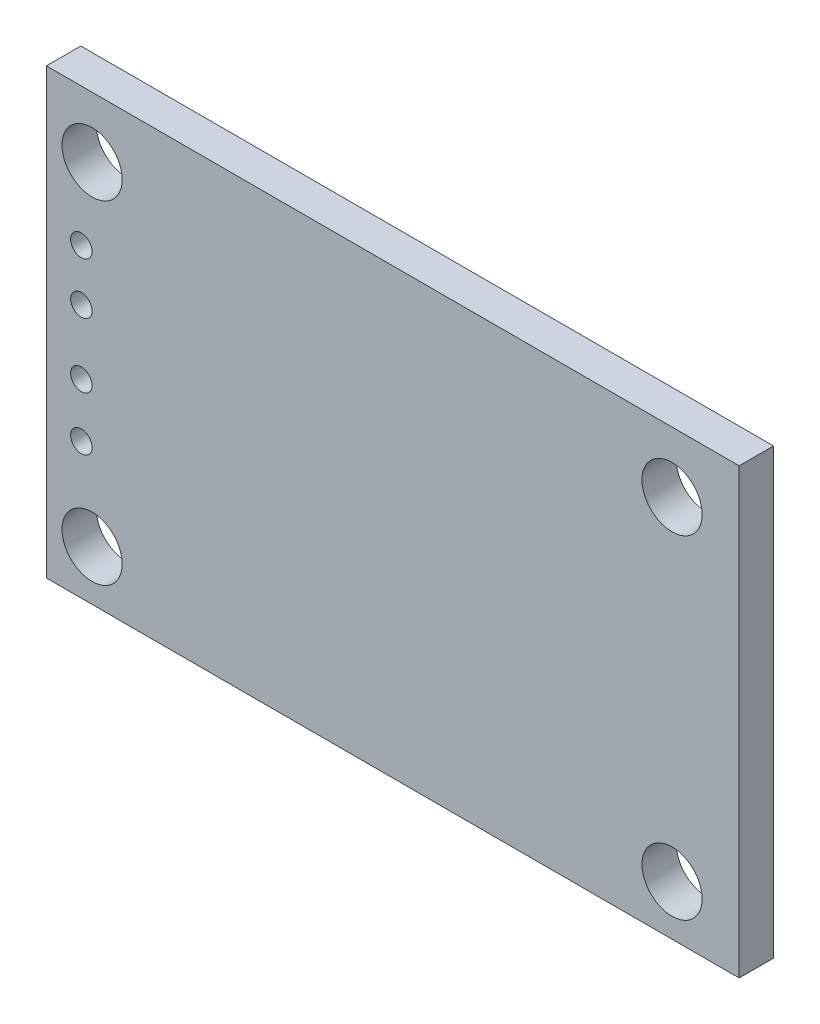
ISO-10303-21;
HEADER;
FILE_DESCRIPTION(('STEP AP214'),'2;1');
FILE_NAME('part.step','',(''),(''),'','','');
FILE_SCHEMA(('AUTOMOTIVE_DESIGN { 1 0 10303 214 1 1 1 1 }'));
ENDSEC;
DATA;
#1=APPLICATION_CONTEXT('core data for automotive mechanical design processes');
#2=APPLICATION_PROTOCOL_DEFINITION('international standard','automotive_design',2000,#1);
#3=PRODUCT_CONTEXT('',#1,'mechanical');
#4=PRODUCT('Part','Part','',(#3));
#5=PRODUCT_RELATED_PRODUCT_CATEGORY('part','',(#4));
#6=PRODUCT_DEFINITION_FORMATION('','',#4);
#7=PRODUCT_DEFINITION_CONTEXT('part definition',#1,'design');
#8=PRODUCT_DEFINITION('design','',#6,#7);
#9=PRODUCT_DEFINITION_SHAPE('','',#8);
#10=(LENGTH_UNIT() NAMED_UNIT(*) SI_UNIT(.MILLI.,.METRE.));
#11=(NAMED_UNIT(*) PLANE_ANGLE_UNIT() SI_UNIT($,.RADIAN.));
#12=(NAMED_UNIT(*) SI_UNIT($,.STERADIAN.) SOLID_ANGLE_UNIT());
#13=UNCERTAINTY_MEASURE_WITH_UNIT(LENGTH_MEASURE(1.E-05),#10,'distance_accuracy_value','');
#14=(GEOMETRIC_REPRESENTATION_CONTEXT(3) GLOBAL_UNCERTAINTY_ASSIGNED_CONTEXT((#13)) GLOBAL_UNIT_ASSIGNED_CONTEXT((#10,
#11,#12)) REPRESENTATION_CONTEXT('',''));
#15=CARTESIAN_POINT('',(0.,0.,0.));
#16=DIRECTION('',(0.,0.,1.));
#17=DIRECTION('',(1.,0.,0.));
#18=AXIS2_PLACEMENT_3D('',#15,#16,#17);
#19=CARTESIAN_POINT('',(-14.50000021606,1.500000022352,1.6));
#20=DIRECTION('',(0.,0.,-1.));
#21=DIRECTION('',(-1.,0.,0.));
#22=AXIS2_PLACEMENT_3D('',#19,#20,#21);
#23=CYLINDRICAL_SURFACE('',#22,0.5);
#24=CARTESIAN_POINT('',(-14.50000021606,1.500000022352,0.));
#25=DIRECTION('',(0.,0.,1.));
#26=DIRECTION('',(-1.,0.,0.));
#27=AXIS2_PLACEMENT_3D('',#24,#25,#26);
#28=CIRCLE('',#27,0.5);
#29=CARTESIAN_POINT('',(-15.00000021606,1.500000022352,0.));
#30=VERTEX_POINT('',#29);
#31=EDGE_CURVE('E94',#30,#30,#28,.T.);
#32=ORIENTED_EDGE('',*,*,#31,.F.);
#33=EDGE_LOOP('',(#32));
#34=FACE_BOUND('',#33,.T.);
#35=CARTESIAN_POINT('',(-14.50000021606,1.500000022352,1.6));
#36=DIRECTION('',(0.,0.,-1.));
#37=DIRECTION('',(-1.,0.,0.));
#38=AXIS2_PLACEMENT_3D('',#35,#36,#37);
#39=CIRCLE('',#38,0.5);
#40=CARTESIAN_POINT('',(-15.00000021606,1.500000022352,1.6));
#41=VERTEX_POINT('',#40);
#42=EDGE_CURVE('E82',#41,#41,#39,.T.);
#43=ORIENTED_EDGE('',*,*,#42,.F.);
#44=EDGE_LOOP('',(#43));
#45=FACE_BOUND('',#44,.T.);
#46=ADVANCED_FACE('F17',(#34,#45),#23,.F.);
#47=CARTESIAN_POINT('',(-14.50000021606,-1.500000022352,1.6));
#48=DIRECTION('',(0.,0.,-1.));
#49=DIRECTION('',(-1.,0.,0.));
#50=AXIS2_PLACEMENT_3D('',#47,#48,#49);
#51=CYLINDRICAL_SURFACE('',#50,0.5);
#52=CARTESIAN_POINT('',(-14.50000021606,-1.500000022352,0.));
#53=DIRECTION('',(0.,0.,1.));
#54=DIRECTION('',(-1.,0.,0.));
#55=AXIS2_PLACEMENT_3D('',#52,#53,#54);
#56=CIRCLE('',#55,0.5);
#57=CARTESIAN_POINT('',(-15.00000021606,-1.500000022352,0.));
#58=VERTEX_POINT('',#57);
#59=EDGE_CURVE('E129',#58,#58,#56,.T.);
#60=ORIENTED_EDGE('',*,*,#59,.F.);
#61=EDGE_LOOP('',(#60));
#62=FACE_BOUND('',#61,.T.);
#63=CARTESIAN_POINT('',(-14.50000021606,-1.500000022352,1.6));
#64=DIRECTION('',(0.,0.,-1.));
#65=DIRECTION('',(-1.,0.,0.));
#66=AXIS2_PLACEMENT_3D('',#63,#64,#65);
#67=CIRCLE('',#66,0.5);
#68=CARTESIAN_POINT('',(-15.00000021606,-1.500000022352,1.6));
#69=VERTEX_POINT('',#68);
#70=EDGE_CURVE('E132',#69,#69,#67,.T.);
#71=ORIENTED_EDGE('',*,*,#70,.F.);
#72=EDGE_LOOP('',(#71));
#73=FACE_BOUND('',#72,.T.);
#74=ADVANCED_FACE('F144',(#62,#73),#51,.F.);
#75=CARTESIAN_POINT('',(-14.50000021606,3.899999940395,1.6));
#76=DIRECTION('',(0.,0.,-1.));
#77=DIRECTION('',(-1.,0.,0.));
#78=AXIS2_PLACEMENT_3D('',#75,#76,#77);
#79=CYLINDRICAL_SURFACE('',#78,0.5);
#80=CARTESIAN_POINT('',(-14.50000021606,3.899999940395,0.));
#81=DIRECTION('',(0.,0.,1.));
#82=DIRECTION('',(-1.,0.,0.));
#83=AXIS2_PLACEMENT_3D('',#80,#81,#82);
#84=CIRCLE('',#83,0.5);
#85=CARTESIAN_POINT('',(-15.00000021606,3.899999940395,0.));
#86=VERTEX_POINT('',#85);
#87=EDGE_CURVE('E123',#86,#86,#84,.T.);
#88=ORIENTED_EDGE('',*,*,#87,.F.);
#89=EDGE_LOOP('',(#88));
#90=FACE_BOUND('',#89,.T.);
#91=CARTESIAN_POINT('',(-14.50000021606,3.899999940395,1.6));
#92=DIRECTION('',(0.,0.,-1.));
#93=DIRECTION('',(-1.,0.,0.));
#94=AXIS2_PLACEMENT_3D('',#91,#92,#93);
#95=CIRCLE('',#94,0.5);
#96=CARTESIAN_POINT('',(-15.00000021606,3.899999940395,1.6));
#97=VERTEX_POINT('',#96);
#98=EDGE_CURVE('E126',#97,#97,#95,.T.);
#99=ORIENTED_EDGE('',*,*,#98,.F.);
#100=EDGE_LOOP('',(#99));
#101=FACE_BOUND('',#100,.T.);
#102=ADVANCED_FACE('F151',(#90,#101),#79,.F.);
#103=CARTESIAN_POINT('',(-14.50000021606,-4.000000059605,1.6));
#104=DIRECTION('',(0.,0.,-1.));
#105=DIRECTION('',(-1.,0.,0.));
#106=AXIS2_PLACEMENT_3D('',#103,#104,#105);
#107=CYLINDRICAL_SURFACE('',#106,0.5);
#108=CARTESIAN_POINT('',(-14.50000021606,-4.000000059605,0.));
#109=DIRECTION('',(0.,0.,1.));
#110=DIRECTION('',(-1.,0.,0.));
#111=AXIS2_PLACEMENT_3D('',#108,#109,#110);
#112=CIRCLE('',#111,0.5);
#113=CARTESIAN_POINT('',(-15.00000021606,-4.000000059605,0.));
#114=VERTEX_POINT('',#113);
#115=EDGE_CURVE('E117',#114,#114,#112,.T.);
#116=ORIENTED_EDGE('',*,*,#115,.F.);
#117=EDGE_LOOP('',(#116));
#118=FACE_BOUND('',#117,.T.);
#119=CARTESIAN_POINT('',(-14.50000021606,-4.000000059605,1.6));
#120=DIRECTION('',(0.,0.,-1.));
#121=DIRECTION('',(-1.,0.,0.));
#122=AXIS2_PLACEMENT_3D('',#119,#120,#121);
#123=CIRCLE('',#122,0.5);
#124=CARTESIAN_POINT('',(-15.00000021606,-4.000000059605,1.6));
#125=VERTEX_POINT('',#124);
#126=EDGE_CURVE('E120',#125,#125,#123,.T.);
#127=ORIENTED_EDGE('',*,*,#126,.F.);
#128=EDGE_LOOP('',(#127));
#129=FACE_BOUND('',#128,.T.);
#130=ADVANCED_FACE('F158',(#118,#129),#107,.F.);
#131=CARTESIAN_POINT('',(12.999999791384,7.499999880791,1.6));
#132=DIRECTION('',(0.,0.,-1.));
#133=DIRECTION('',(-1.,0.,0.));
#134=AXIS2_PLACEMENT_3D('',#131,#132,#133);
#135=CYLINDRICAL_SURFACE('',#134,1.4);
#136=CARTESIAN_POINT('',(12.999999791384,7.499999880791,0.));
#137=DIRECTION('',(0.,0.,1.));
#138=DIRECTION('',(-1.,0.,0.));
#139=AXIS2_PLACEMENT_3D('',#136,#137,#138);
#140=CIRCLE('',#139,1.4);
#141=CARTESIAN_POINT('',(11.599999791384,7.499999880791,0.));
#142=VERTEX_POINT('',#141);
#143=EDGE_CURVE('E111',#142,#142,#140,.T.);
#144=ORIENTED_EDGE('',*,*,#143,.F.);
#145=EDGE_LOOP('',(#144));
#146=FACE_BOUND('',#145,.T.);
#147=CARTESIAN_POINT('',(12.999999791384,7.499999880791,1.6));
#148=DIRECTION('',(0.,0.,-1.));
#149=DIRECTION('',(-1.,0.,0.));
#150=AXIS2_PLACEMENT_3D('',#147,#148,#149);
#151=CIRCLE('',#150,1.4);
#152=CARTESIAN_POINT('',(11.599999791384,7.499999880791,1.6));
#153=VERTEX_POINT('',#152);
#154=EDGE_CURVE('E114',#153,#153,#151,.T.);
#155=ORIENTED_EDGE('',*,*,#154,.F.);
#156=EDGE_LOOP('',(#155));
#157=FACE_BOUND('',#156,.T.);
#158=ADVANCED_FACE('F162',(#146,#157),#135,.F.);
#159=CARTESIAN_POINT('',(12.999999791384,-8.000000119209,1.6));
#160=DIRECTION('',(0.,0.,-1.));
#161=DIRECTION('',(-1.,0.,0.));
#162=AXIS2_PLACEMENT_3D('',#159,#160,#161);
#163=CYLINDRICAL_SURFACE('',#162,1.4);
#164=CARTESIAN_POINT('',(12.999999791384,-8.000000119209,0.));
#165=DIRECTION('',(0.,0.,1.));
#166=DIRECTION('',(-1.,0.,0.));
#167=AXIS2_PLACEMENT_3D('',#164,#165,#166);
#168=CIRCLE('',#167,1.4);
#169=CARTESIAN_POINT('',(11.599999791384,-8.000000119209,0.));
#170=VERTEX_POINT('',#169);
#171=EDGE_CURVE('E105',#170,#170,#168,.T.);
#172=ORIENTED_EDGE('',*,*,#171,.F.);
#173=EDGE_LOOP('',(#172));
#174=FACE_BOUND('',#173,.T.);
#175=CARTESIAN_POINT('',(12.999999791384,-8.000000119209,1.6));
#176=DIRECTION('',(0.,0.,-1.));
#177=DIRECTION('',(-1.,0.,0.));
#178=AXIS2_PLACEMENT_3D('',#175,#176,#177);
#179=CIRCLE('',#178,1.4);
#180=CARTESIAN_POINT('',(11.599999791384,-8.000000119209,1.6));
#181=VERTEX_POINT('',#180);
#182=EDGE_CURVE('E108',#181,#181,#179,.T.);
#183=ORIENTED_EDGE('',*,*,#182,.F.);
#184=EDGE_LOOP('',(#183));
#185=FACE_BOUND('',#184,.T.);
#186=ADVANCED_FACE('F166',(#174,#185),#163,.F.);
#187=CARTESIAN_POINT('',(-14.00000020861,7.499999880791,1.6));
#188=DIRECTION('',(0.,0.,-1.));
#189=DIRECTION('',(-1.,0.,0.));
#190=AXIS2_PLACEMENT_3D('',#187,#188,#189);
#191=CYLINDRICAL_SURFACE('',#190,1.4);
#192=CARTESIAN_POINT('',(-14.00000020861,7.499999880791,0.));
#193=DIRECTION('',(0.,0.,1.));
#194=DIRECTION('',(-1.,0.,0.));
#195=AXIS2_PLACEMENT_3D('',#192,#193,#194);
#196=CIRCLE('',#195,1.4);
#197=CARTESIAN_POINT('',(-15.40000020861,7.499999880791,0.));
#198=VERTEX_POINT('',#197);
#199=EDGE_CURVE('E101',#198,#198,#196,.T.);
#200=ORIENTED_EDGE('',*,*,#199,.F.);
#201=EDGE_LOOP('',(#200));
#202=FACE_BOUND('',#201,.T.);
#203=CARTESIAN_POINT('',(-14.00000020861,7.499999880791,1.6));
#204=DIRECTION('',(0.,0.,-1.));
#205=DIRECTION('',(-1.,0.,0.));
#206=AXIS2_PLACEMENT_3D('',#203,#204,#205);
#207=CIRCLE('',#206,1.4);
#208=CARTESIAN_POINT('',(-15.40000020861,7.499999880791,1.6));
#209=VERTEX_POINT('',#208);
#210=EDGE_CURVE('E88',#209,#209,#207,.T.);
#211=ORIENTED_EDGE('',*,*,#210,.F.);
#212=EDGE_LOOP('',(#211));
#213=FACE_BOUND('',#212,.T.);
#214=ADVANCED_FACE('F170',(#202,#213),#191,.F.);
#215=CARTESIAN_POINT('',(-14.00000020861,-8.000000119209,1.6));
#216=DIRECTION('',(0.,0.,-1.));
#217=DIRECTION('',(-1.,0.,0.));
#218=AXIS2_PLACEMENT_3D('',#215,#216,#217);
#219=CYLINDRICAL_SURFACE('',#218,1.4);
#220=CARTESIAN_POINT('',(-14.00000020861,-8.000000119209,0.));
#221=DIRECTION('',(0.,0.,1.));
#222=DIRECTION('',(-1.,0.,0.));
#223=AXIS2_PLACEMENT_3D('',#220,#221,#222);
#224=CIRCLE('',#223,1.4);
#225=CARTESIAN_POINT('',(-15.40000020861,-8.000000119209,0.));
#226=VERTEX_POINT('',#225);
#227=EDGE_CURVE('E99',#226,#226,#224,.T.);
#228=ORIENTED_EDGE('',*,*,#227,.F.);
#229=EDGE_LOOP('',(#228));
#230=FACE_BOUND('',#229,.T.);
#231=CARTESIAN_POINT('',(-14.00000020861,-8.000000119209,1.6));
#232=DIRECTION('',(0.,0.,-1.));
#233=DIRECTION('',(-1.,0.,0.));
#234=AXIS2_PLACEMENT_3D('',#231,#232,#233);
#235=CIRCLE('',#234,1.4);
#236=CARTESIAN_POINT('',(-15.40000020861,-8.000000119209,1.6));
#237=VERTEX_POINT('',#236);
#238=EDGE_CURVE('E86',#237,#237,#235,.T.);
#239=ORIENTED_EDGE('',*,*,#238,.F.);
#240=EDGE_LOOP('',(#239));
#241=FACE_BOUND('',#240,.T.);
#242=ADVANCED_FACE('F174',(#230,#241),#219,.F.);
#243=CARTESIAN_POINT('',(16.125,-10.325,0.));
#244=DIRECTION('',(1.,0.,0.));
#245=DIRECTION('',(0.,1.,0.));
#246=AXIS2_PLACEMENT_3D('',#243,#244,#245);
#247=PLANE('',#246);
#248=DIRECTION('',(0.,-1.,0.));
#249=VECTOR('',#248,1.);
#250=CARTESIAN_POINT('',(16.125,10.325,0.));
#251=LINE('',#250,#249);
#252=CARTESIAN_POINT('',(16.125,10.325,0.));
#253=VERTEX_POINT('',#252);
#254=CARTESIAN_POINT('',(16.125,-10.325,0.));
#255=VERTEX_POINT('',#254);
#256=EDGE_CURVE('E35',#253,#255,#251,.T.);
#257=ORIENTED_EDGE('',*,*,#256,.F.);
#258=DIRECTION('',(0.,0.,1.));
#259=VECTOR('',#258,1.);
#260=CARTESIAN_POINT('',(16.125,10.325,0.));
#261=LINE('',#260,#259);
#262=CARTESIAN_POINT('',(16.125,10.325,1.6));
#263=VERTEX_POINT('',#262);
#264=EDGE_CURVE('E11',#253,#263,#261,.T.);
#265=ORIENTED_EDGE('',*,*,#264,.T.);
#266=DIRECTION('',(0.,1.,0.));
#267=VECTOR('',#266,1.);
#268=CARTESIAN_POINT('',(16.125,10.325,1.6));
#269=LINE('',#268,#267);
#270=CARTESIAN_POINT('',(16.125,-10.325,1.6));
#271=VERTEX_POINT('',#270);
#272=EDGE_CURVE('E80',#271,#263,#269,.T.);
#273=ORIENTED_EDGE('',*,*,#272,.F.);
#274=DIRECTION('',(0.,0.,1.));
#275=VECTOR('',#274,1.);
#276=CARTESIAN_POINT('',(16.125,-10.325,0.));
#277=LINE('',#276,#275);
#278=EDGE_CURVE('E27',#255,#271,#277,.T.);
#279=ORIENTED_EDGE('',*,*,#278,.F.);
#280=EDGE_LOOP('',(#257,#265,#273,#279));
#281=FACE_BOUND('',#280,.T.);
#282=ADVANCED_FACE('F84',(#281),#247,.T.);
#283=CARTESIAN_POINT('',(-16.125,-10.325,0.));
#284=DIRECTION('',(0.,-1.,0.));
#285=DIRECTION('',(1.,0.,0.));
#286=AXIS2_PLACEMENT_3D('',#283,#284,#285);
#287=PLANE('',#286);
#288=DIRECTION('',(-1.,0.,0.));
#289=VECTOR('',#288,1.);
#290=CARTESIAN_POINT('',(16.125,-10.325,0.));
#291=LINE('',#290,#289);
#292=CARTESIAN_POINT('',(-16.125,-10.325,0.));
#293=VERTEX_POINT('',#292);
#294=EDGE_CURVE('E90',#255,#293,#291,.T.);
#295=ORIENTED_EDGE('',*,*,#294,.F.);
#296=ORIENTED_EDGE('',*,*,#278,.T.);
#297=DIRECTION('',(1.,0.,0.));
#298=VECTOR('',#297,1.);
#299=CARTESIAN_POINT('',(16.125,-10.325,1.6));
#300=LINE('',#299,#298);
#301=CARTESIAN_POINT('',(-16.125,-10.325,1.6));
#302=VERTEX_POINT('',#301);
#303=EDGE_CURVE('E71',#302,#271,#300,.T.);
#304=ORIENTED_EDGE('',*,*,#303,.F.);
#305=DIRECTION('',(0.,0.,1.));
#306=VECTOR('',#305,1.);
#307=CARTESIAN_POINT('',(-16.125,-10.325,0.));
#308=LINE('',#307,#306);
#309=EDGE_CURVE('E67',#293,#302,#308,.T.);
#310=ORIENTED_EDGE('',*,*,#309,.F.);
#311=EDGE_LOOP('',(#295,#296,#304,#310));
#312=FACE_BOUND('',#311,.T.);
#313=ADVANCED_FACE('F181',(#312),#287,.T.);
#314=CARTESIAN_POINT('',(-16.125,10.325,0.));
#315=DIRECTION('',(-1.,0.,0.));
#316=DIRECTION('',(0.,-1.,0.));
#317=AXIS2_PLACEMENT_3D('',#314,#315,#316);
#318=PLANE('',#317);
#319=DIRECTION('',(0.,1.,0.));
#320=VECTOR('',#319,1.);
#321=CARTESIAN_POINT('',(-16.125,-10.325,0.));
#322=LINE('',#321,#320);
#323=CARTESIAN_POINT('',(-16.125,10.325,0.));
#324=VERTEX_POINT('',#323);
#325=EDGE_CURVE('E55',#293,#324,#322,.T.);
#326=ORIENTED_EDGE('',*,*,#325,.F.);
#327=ORIENTED_EDGE('',*,*,#309,.T.);
#328=DIRECTION('',(0.,-1.,0.));
#329=VECTOR('',#328,1.);
#330=CARTESIAN_POINT('',(-16.125,-10.325,1.6));
#331=LINE('',#330,#329);
#332=CARTESIAN_POINT('',(-16.125,10.325,1.6));
#333=VERTEX_POINT('',#332);
#334=EDGE_CURVE('E61',#333,#302,#331,.T.);
#335=ORIENTED_EDGE('',*,*,#334,.F.);
#336=DIRECTION('',(0.,0.,1.));
#337=VECTOR('',#336,1.);
#338=CARTESIAN_POINT('',(-16.125,10.325,0.));
#339=LINE('',#338,#337);
#340=EDGE_CURVE('E64',#324,#333,#339,.T.);
#341=ORIENTED_EDGE('',*,*,#340,.F.);
#342=EDGE_LOOP('',(#326,#327,#335,#341));
#343=FACE_BOUND('',#342,.T.);
#344=ADVANCED_FACE('F63',(#343),#318,.T.);
#345=CARTESIAN_POINT('',(16.125,10.325,0.));
#346=DIRECTION('',(0.,1.,0.));
#347=DIRECTION('',(-1.,0.,0.));
#348=AXIS2_PLACEMENT_3D('',#345,#346,#347);
#349=PLANE('',#348);
#350=DIRECTION('',(1.,0.,0.));
#351=VECTOR('',#350,1.);
#352=CARTESIAN_POINT('',(-16.125,10.325,0.));
#353=LINE('',#352,#351);
#354=EDGE_CURVE('E76',#324,#253,#353,.T.);
#355=ORIENTED_EDGE('',*,*,#354,.F.);
#356=ORIENTED_EDGE('',*,*,#340,.T.);
#357=DIRECTION('',(-1.,0.,0.));
#358=VECTOR('',#357,1.);
#359=CARTESIAN_POINT('',(-16.125,10.325,1.6));
#360=LINE('',#359,#358);
#361=EDGE_CURVE('E21',#263,#333,#360,.T.);
#362=ORIENTED_EDGE('',*,*,#361,.F.);
#363=ORIENTED_EDGE('',*,*,#264,.F.);
#364=EDGE_LOOP('',(#355,#356,#362,#363));
#365=FACE_BOUND('',#364,.T.);
#366=ADVANCED_FACE('F75',(#365),#349,.T.);
#367=CARTESIAN_POINT('',(0.,0.,1.6));
#368=DIRECTION('',(0.,0.,1.));
#369=DIRECTION('',(1.,0.,0.));
#370=AXIS2_PLACEMENT_3D('',#367,#368,#369);
#371=PLANE('',#370);
#372=ORIENTED_EDGE('',*,*,#361,.T.);
#373=ORIENTED_EDGE('',*,*,#334,.T.);
#374=ORIENTED_EDGE('',*,*,#303,.T.);
#375=ORIENTED_EDGE('',*,*,#272,.T.);
#376=EDGE_LOOP('',(#372,#373,#374,#375));
#377=FACE_BOUND('',#376,.T.);
#378=ORIENTED_EDGE('',*,*,#42,.T.);
#379=EDGE_LOOP('',(#378));
#380=FACE_BOUND('',#379,.T.);
#381=ORIENTED_EDGE('',*,*,#70,.T.);
#382=EDGE_LOOP('',(#381));
#383=FACE_BOUND('',#382,.T.);
#384=ORIENTED_EDGE('',*,*,#98,.T.);
#385=EDGE_LOOP('',(#384));
#386=FACE_BOUND('',#385,.T.);
#387=ORIENTED_EDGE('',*,*,#126,.T.);
#388=EDGE_LOOP('',(#387));
#389=FACE_BOUND('',#388,.T.);
#390=ORIENTED_EDGE('',*,*,#154,.T.);
#391=EDGE_LOOP('',(#390));
#392=FACE_BOUND('',#391,.T.);
#393=ORIENTED_EDGE('',*,*,#182,.T.);
#394=EDGE_LOOP('',(#393));
#395=FACE_BOUND('',#394,.T.);
#396=ORIENTED_EDGE('',*,*,#210,.T.);
#397=EDGE_LOOP('',(#396));
#398=FACE_BOUND('',#397,.T.);
#399=ORIENTED_EDGE('',*,*,#238,.T.);
#400=EDGE_LOOP('',(#399));
#401=FACE_BOUND('',#400,.T.);
#402=ADVANCED_FACE('F78',(#377,#380,#383,#386,#389,#392,#395,#398,#401),#371,.T.);
#403=CARTESIAN_POINT('',(0.,0.,0.));
#404=DIRECTION('',(0.,0.,1.));
#405=DIRECTION('',(1.,0.,0.));
#406=AXIS2_PLACEMENT_3D('',#403,#404,#405);
#407=PLANE('',#406);
#408=ORIENTED_EDGE('',*,*,#354,.T.);
#409=ORIENTED_EDGE('',*,*,#256,.T.);
#410=ORIENTED_EDGE('',*,*,#294,.T.);
#411=ORIENTED_EDGE('',*,*,#325,.T.);
#412=EDGE_LOOP('',(#408,#409,#410,#411));
#413=FACE_BOUND('',#412,.T.);
#414=ORIENTED_EDGE('',*,*,#31,.T.);
#415=EDGE_LOOP('',(#414));
#416=FACE_BOUND('',#415,.T.);
#417=ORIENTED_EDGE('',*,*,#59,.T.);
#418=EDGE_LOOP('',(#417));
#419=FACE_BOUND('',#418,.T.);
#420=ORIENTED_EDGE('',*,*,#87,.T.);
#421=EDGE_LOOP('',(#420));
#422=FACE_BOUND('',#421,.T.);
#423=ORIENTED_EDGE('',*,*,#115,.T.);
#424=EDGE_LOOP('',(#423));
#425=FACE_BOUND('',#424,.T.);
#426=ORIENTED_EDGE('',*,*,#143,.T.);
#427=EDGE_LOOP('',(#426));
#428=FACE_BOUND('',#427,.T.);
#429=ORIENTED_EDGE('',*,*,#171,.T.);
#430=EDGE_LOOP('',(#429));
#431=FACE_BOUND('',#430,.T.);
#432=ORIENTED_EDGE('',*,*,#199,.T.);
#433=EDGE_LOOP('',(#432));
#434=FACE_BOUND('',#433,.T.);
#435=ORIENTED_EDGE('',*,*,#227,.T.);
#436=EDGE_LOOP('',(#435));
#437=FACE_BOUND('',#436,.T.);
#438=ADVANCED_FACE('F19',(#413,#416,#419,#422,#425,#428,#431,#434,#437),#407,.F.);
#439=CLOSED_SHELL('',(#46,#74,#102,#130,#158,#186,#214,#242,#282,#313,#344,#366,#402,#438));
#440=MANIFOLD_SOLID_BREP('B1',#439);
#441=ADVANCED_BREP_SHAPE_REPRESENTATION('',(#18,#440),#14);
#442=SHAPE_DEFINITION_REPRESENTATION(#9,#441);
ENDSEC;
END-ISO-10303-21;
